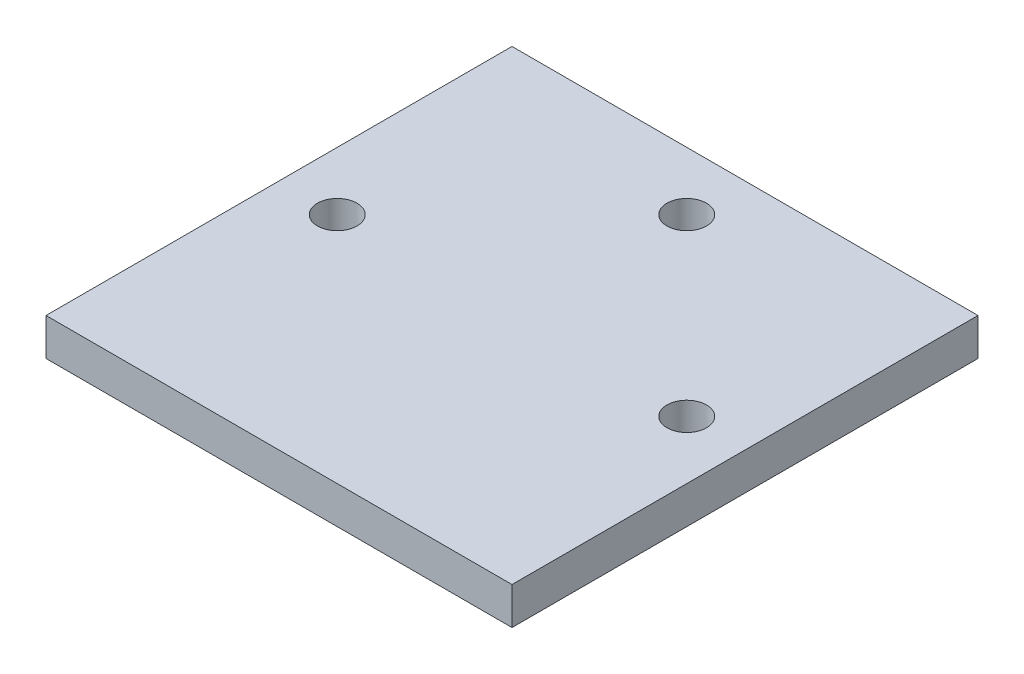
ISO-10303-21;
HEADER;
FILE_DESCRIPTION(('STEP AP214'),'2;1');
FILE_NAME('part.step','',(''),(''),'','','');
FILE_SCHEMA(('AUTOMOTIVE_DESIGN { 1 0 10303 214 1 1 1 1 }'));
ENDSEC;
DATA;
#1=APPLICATION_CONTEXT('core data for automotive mechanical design processes');
#2=APPLICATION_PROTOCOL_DEFINITION('international standard','automotive_design',2000,#1);
#3=PRODUCT_CONTEXT('',#1,'mechanical');
#4=PRODUCT('Part','Part','',(#3));
#5=PRODUCT_RELATED_PRODUCT_CATEGORY('part','',(#4));
#6=PRODUCT_DEFINITION_FORMATION('','',#4);
#7=PRODUCT_DEFINITION_CONTEXT('part definition',#1,'design');
#8=PRODUCT_DEFINITION('design','',#6,#7);
#9=PRODUCT_DEFINITION_SHAPE('','',#8);
#10=(LENGTH_UNIT() NAMED_UNIT(*) SI_UNIT(.MILLI.,.METRE.));
#11=(NAMED_UNIT(*) PLANE_ANGLE_UNIT() SI_UNIT($,.RADIAN.));
#12=(NAMED_UNIT(*) SI_UNIT($,.STERADIAN.) SOLID_ANGLE_UNIT());
#13=UNCERTAINTY_MEASURE_WITH_UNIT(LENGTH_MEASURE(1.E-05),#10,'distance_accuracy_value','');
#14=(GEOMETRIC_REPRESENTATION_CONTEXT(3) GLOBAL_UNCERTAINTY_ASSIGNED_CONTEXT((#13)) GLOBAL_UNIT_ASSIGNED_CONTEXT((#10,
#11,#12)) REPRESENTATION_CONTEXT('',''));
#15=CARTESIAN_POINT('',(0.,0.,0.));
#16=DIRECTION('',(0.,0.,1.));
#17=DIRECTION('',(1.,0.,0.));
#18=AXIS2_PLACEMENT_3D('',#15,#16,#17);
#19=CARTESIAN_POINT('',(100.,-16.,100.));
#20=DIRECTION('',(1.,0.,0.));
#21=DIRECTION('',(0.,0.,-1.));
#22=AXIS2_PLACEMENT_3D('',#19,#20,#21);
#23=PLANE('',#22);
#24=DIRECTION('',(0.,0.,-1.));
#25=VECTOR('',#24,1.);
#26=CARTESIAN_POINT('',(100.,0.,100.));
#27=LINE('',#26,#25);
#28=CARTESIAN_POINT('',(100.,0.,100.));
#29=VERTEX_POINT('',#28);
#30=CARTESIAN_POINT('',(100.,0.,-100.));
#31=VERTEX_POINT('',#30);
#32=EDGE_CURVE('E102',#29,#31,#27,.T.);
#33=ORIENTED_EDGE('',*,*,#32,.F.);
#34=DIRECTION('',(0.,1.,0.));
#35=VECTOR('',#34,1.);
#36=CARTESIAN_POINT('',(100.,-16.,100.));
#37=LINE('',#36,#35);
#38=CARTESIAN_POINT('',(100.,-16.,100.));
#39=VERTEX_POINT('',#38);
#40=EDGE_CURVE('E11',#39,#29,#37,.T.);
#41=ORIENTED_EDGE('',*,*,#40,.F.);
#42=DIRECTION('',(0.,0.,-1.));
#43=VECTOR('',#42,1.);
#44=CARTESIAN_POINT('',(100.,-16.,100.));
#45=LINE('',#44,#43);
#46=CARTESIAN_POINT('',(100.,-16.,-100.));
#47=VERTEX_POINT('',#46);
#48=EDGE_CURVE('E95',#39,#47,#45,.T.);
#49=ORIENTED_EDGE('',*,*,#48,.T.);
#50=DIRECTION('',(0.,1.,0.));
#51=VECTOR('',#50,1.);
#52=CARTESIAN_POINT('',(100.,-16.,-100.));
#53=LINE('',#52,#51);
#54=EDGE_CURVE('E40',#47,#31,#53,.T.);
#55=ORIENTED_EDGE('',*,*,#54,.T.);
#56=EDGE_LOOP('',(#33,#41,#49,#55));
#57=FACE_BOUND('',#56,.T.);
#58=ADVANCED_FACE('F37',(#57),#23,.T.);
#59=CARTESIAN_POINT('',(-100.,-16.,100.));
#60=DIRECTION('',(0.,0.,1.));
#61=DIRECTION('',(1.,0.,0.));
#62=AXIS2_PLACEMENT_3D('',#59,#60,#61);
#63=PLANE('',#62);
#64=DIRECTION('',(1.,0.,0.));
#65=VECTOR('',#64,1.);
#66=CARTESIAN_POINT('',(-100.,0.,100.));
#67=LINE('',#66,#65);
#68=CARTESIAN_POINT('',(-100.,0.,100.));
#69=VERTEX_POINT('',#68);
#70=EDGE_CURVE('E97',#69,#29,#67,.T.);
#71=ORIENTED_EDGE('',*,*,#70,.F.);
#72=DIRECTION('',(0.,1.,0.));
#73=VECTOR('',#72,1.);
#74=CARTESIAN_POINT('',(-100.,-16.,100.));
#75=LINE('',#74,#73);
#76=CARTESIAN_POINT('',(-100.,-16.,100.));
#77=VERTEX_POINT('',#76);
#78=EDGE_CURVE('E46',#77,#69,#75,.T.);
#79=ORIENTED_EDGE('',*,*,#78,.F.);
#80=DIRECTION('',(1.,0.,0.));
#81=VECTOR('',#80,1.);
#82=CARTESIAN_POINT('',(-100.,-16.,100.));
#83=LINE('',#82,#81);
#84=EDGE_CURVE('E92',#77,#39,#83,.T.);
#85=ORIENTED_EDGE('',*,*,#84,.T.);
#86=ORIENTED_EDGE('',*,*,#40,.T.);
#87=EDGE_LOOP('',(#71,#79,#85,#86));
#88=FACE_BOUND('',#87,.T.);
#89=ADVANCED_FACE('F113',(#88),#63,.T.);
#90=CARTESIAN_POINT('',(-100.,-16.,100.));
#91=DIRECTION('',(-1.,0.,0.));
#92=DIRECTION('',(0.,0.,1.));
#93=AXIS2_PLACEMENT_3D('',#90,#91,#92);
#94=PLANE('',#93);
#95=DIRECTION('',(0.,0.,1.));
#96=VECTOR('',#95,1.);
#97=CARTESIAN_POINT('',(-100.,0.,100.));
#98=LINE('',#97,#96);
#99=CARTESIAN_POINT('',(-100.,0.,-100.));
#100=VERTEX_POINT('',#99);
#101=EDGE_CURVE('E87',#100,#69,#98,.T.);
#102=ORIENTED_EDGE('',*,*,#101,.F.);
#103=DIRECTION('',(0.,1.,0.));
#104=VECTOR('',#103,1.);
#105=CARTESIAN_POINT('',(-100.,-16.,-100.));
#106=LINE('',#105,#104);
#107=CARTESIAN_POINT('',(-100.,-16.,-100.));
#108=VERTEX_POINT('',#107);
#109=EDGE_CURVE('E82',#108,#100,#106,.T.);
#110=ORIENTED_EDGE('',*,*,#109,.F.);
#111=DIRECTION('',(0.,0.,1.));
#112=VECTOR('',#111,1.);
#113=CARTESIAN_POINT('',(-100.,-16.,100.));
#114=LINE('',#113,#112);
#115=EDGE_CURVE('E85',#108,#77,#114,.T.);
#116=ORIENTED_EDGE('',*,*,#115,.T.);
#117=ORIENTED_EDGE('',*,*,#78,.T.);
#118=EDGE_LOOP('',(#102,#110,#116,#117));
#119=FACE_BOUND('',#118,.T.);
#120=ADVANCED_FACE('F84',(#119),#94,.T.);
#121=CARTESIAN_POINT('',(-100.,-16.,-100.));
#122=DIRECTION('',(0.,0.,-1.));
#123=DIRECTION('',(-1.,0.,0.));
#124=AXIS2_PLACEMENT_3D('',#121,#122,#123);
#125=PLANE('',#124);
#126=DIRECTION('',(-1.,0.,0.));
#127=VECTOR('',#126,1.);
#128=CARTESIAN_POINT('',(-100.,0.,-100.));
#129=LINE('',#128,#127);
#130=EDGE_CURVE('E105',#31,#100,#129,.T.);
#131=ORIENTED_EDGE('',*,*,#130,.F.);
#132=ORIENTED_EDGE('',*,*,#54,.F.);
#133=DIRECTION('',(-1.,0.,0.));
#134=VECTOR('',#133,1.);
#135=CARTESIAN_POINT('',(-100.,-16.,-100.));
#136=LINE('',#135,#134);
#137=EDGE_CURVE('E91',#47,#108,#136,.T.);
#138=ORIENTED_EDGE('',*,*,#137,.T.);
#139=ORIENTED_EDGE('',*,*,#109,.T.);
#140=EDGE_LOOP('',(#131,#132,#138,#139));
#141=FACE_BOUND('',#140,.T.);
#142=ADVANCED_FACE('F94',(#141),#125,.T.);
#143=CARTESIAN_POINT('',(0.,-16.,0.));
#144=DIRECTION('',(0.,-1.,0.));
#145=DIRECTION('',(0.,0.,-1.));
#146=AXIS2_PLACEMENT_3D('',#143,#144,#145);
#147=PLANE('',#146);
#148=CARTESIAN_POINT('',(75.,-16.,0.));
#149=DIRECTION('',(0.,1.,0.));
#150=DIRECTION('',(0.,0.,1.));
#151=AXIS2_PLACEMENT_3D('',#148,#149,#150);
#152=CIRCLE('',#151,8.50000000000001);
#153=CARTESIAN_POINT('',(75.,-16.,8.50000000000002));
#154=VERTEX_POINT('',#153);
#155=EDGE_CURVE('E150',#154,#154,#152,.T.);
#156=ORIENTED_EDGE('',*,*,#155,.T.);
#157=EDGE_LOOP('',(#156));
#158=FACE_BOUND('',#157,.T.);
#159=CARTESIAN_POINT('',(-75.,-16.,0.));
#160=DIRECTION('',(0.,1.,0.));
#161=DIRECTION('',(0.,0.,1.));
#162=AXIS2_PLACEMENT_3D('',#159,#160,#161);
#163=CIRCLE('',#162,8.5);
#164=CARTESIAN_POINT('',(-75.,-16.,8.49999999999999));
#165=VERTEX_POINT('',#164);
#166=EDGE_CURVE('E158',#165,#165,#163,.T.);
#167=ORIENTED_EDGE('',*,*,#166,.T.);
#168=EDGE_LOOP('',(#167));
#169=FACE_BOUND('',#168,.T.);
#170=CARTESIAN_POINT('',(0.,-16.,-75.));
#171=DIRECTION('',(0.,1.,0.));
#172=DIRECTION('',(0.,0.,1.));
#173=AXIS2_PLACEMENT_3D('',#170,#171,#172);
#174=CIRCLE('',#173,8.5);
#175=CARTESIAN_POINT('',(0.,-16.,-66.5));
#176=VERTEX_POINT('',#175);
#177=EDGE_CURVE('E106',#176,#176,#174,.T.);
#178=ORIENTED_EDGE('',*,*,#177,.T.);
#179=EDGE_LOOP('',(#178));
#180=FACE_BOUND('',#179,.T.);
#181=ORIENTED_EDGE('',*,*,#48,.F.);
#182=ORIENTED_EDGE('',*,*,#84,.F.);
#183=ORIENTED_EDGE('',*,*,#115,.F.);
#184=ORIENTED_EDGE('',*,*,#137,.F.);
#185=EDGE_LOOP('',(#181,#182,#183,#184));
#186=FACE_BOUND('',#185,.T.);
#187=ADVANCED_FACE('F90',(#158,#169,#180,#186),#147,.T.);
#188=CARTESIAN_POINT('',(0.,0.,0.));
#189=DIRECTION('',(0.,-1.,0.));
#190=DIRECTION('',(0.,0.,-1.));
#191=AXIS2_PLACEMENT_3D('',#188,#189,#190);
#192=PLANE('',#191);
#193=CARTESIAN_POINT('',(75.,0.,0.));
#194=DIRECTION('',(0.,1.,0.));
#195=DIRECTION('',(0.,0.,1.));
#196=AXIS2_PLACEMENT_3D('',#193,#194,#195);
#197=CIRCLE('',#196,8.50000000000001);
#198=CARTESIAN_POINT('',(75.,0.,8.50000000000002));
#199=VERTEX_POINT('',#198);
#200=EDGE_CURVE('E153',#199,#199,#197,.T.);
#201=ORIENTED_EDGE('',*,*,#200,.F.);
#202=EDGE_LOOP('',(#201));
#203=FACE_BOUND('',#202,.T.);
#204=CARTESIAN_POINT('',(-75.,0.,0.));
#205=DIRECTION('',(0.,1.,0.));
#206=DIRECTION('',(0.,0.,1.));
#207=AXIS2_PLACEMENT_3D('',#204,#205,#206);
#208=CIRCLE('',#207,8.5);
#209=CARTESIAN_POINT('',(-75.,0.,8.49999999999999));
#210=VERTEX_POINT('',#209);
#211=EDGE_CURVE('E155',#210,#210,#208,.T.);
#212=ORIENTED_EDGE('',*,*,#211,.F.);
#213=EDGE_LOOP('',(#212));
#214=FACE_BOUND('',#213,.T.);
#215=CARTESIAN_POINT('',(0.,0.,-75.));
#216=DIRECTION('',(0.,1.,0.));
#217=DIRECTION('',(0.,0.,1.));
#218=AXIS2_PLACEMENT_3D('',#215,#216,#217);
#219=CIRCLE('',#218,8.5);
#220=CARTESIAN_POINT('',(0.,0.,-66.5));
#221=VERTEX_POINT('',#220);
#222=EDGE_CURVE('E161',#221,#221,#219,.T.);
#223=ORIENTED_EDGE('',*,*,#222,.F.);
#224=EDGE_LOOP('',(#223));
#225=FACE_BOUND('',#224,.T.);
#226=ORIENTED_EDGE('',*,*,#32,.T.);
#227=ORIENTED_EDGE('',*,*,#130,.T.);
#228=ORIENTED_EDGE('',*,*,#101,.T.);
#229=ORIENTED_EDGE('',*,*,#70,.T.);
#230=EDGE_LOOP('',(#226,#227,#228,#229));
#231=FACE_BOUND('',#230,.T.);
#232=ADVANCED_FACE('F112',(#203,#214,#225,#231),#192,.F.);
#233=CARTESIAN_POINT('',(0.,-16.,-75.));
#234=DIRECTION('',(0.,1.,0.));
#235=DIRECTION('',(0.,0.,1.));
#236=AXIS2_PLACEMENT_3D('',#233,#234,#235);
#237=CYLINDRICAL_SURFACE('',#236,8.5);
#238=ORIENTED_EDGE('',*,*,#177,.F.);
#239=EDGE_LOOP('',(#238));
#240=FACE_BOUND('',#239,.T.);
#241=ORIENTED_EDGE('',*,*,#222,.T.);
#242=EDGE_LOOP('',(#241));
#243=FACE_BOUND('',#242,.T.);
#244=ADVANCED_FACE('F131',(#240,#243),#237,.F.);
#245=CARTESIAN_POINT('',(-75.,-16.,0.));
#246=DIRECTION('',(0.,1.,0.));
#247=DIRECTION('',(0.,0.,1.));
#248=AXIS2_PLACEMENT_3D('',#245,#246,#247);
#249=CYLINDRICAL_SURFACE('',#248,8.5);
#250=ORIENTED_EDGE('',*,*,#166,.F.);
#251=EDGE_LOOP('',(#250));
#252=FACE_BOUND('',#251,.T.);
#253=ORIENTED_EDGE('',*,*,#211,.T.);
#254=EDGE_LOOP('',(#253));
#255=FACE_BOUND('',#254,.T.);
#256=ADVANCED_FACE('F138',(#252,#255),#249,.F.);
#257=CARTESIAN_POINT('',(75.,-16.,0.));
#258=DIRECTION('',(0.,1.,0.));
#259=DIRECTION('',(0.,0.,1.));
#260=AXIS2_PLACEMENT_3D('',#257,#258,#259);
#261=CYLINDRICAL_SURFACE('',#260,8.50000000000001);
#262=ORIENTED_EDGE('',*,*,#155,.F.);
#263=EDGE_LOOP('',(#262));
#264=FACE_BOUND('',#263,.T.);
#265=ORIENTED_EDGE('',*,*,#200,.T.);
#266=EDGE_LOOP('',(#265));
#267=FACE_BOUND('',#266,.T.);
#268=ADVANCED_FACE('F142',(#264,#267),#261,.F.);
#269=CLOSED_SHELL('',(#58,#89,#120,#142,#187,#232,#244,#256,#268));
#270=MANIFOLD_SOLID_BREP('B2',#269);
#271=ADVANCED_BREP_SHAPE_REPRESENTATION('',(#18,#270),#14);
#272=SHAPE_DEFINITION_REPRESENTATION(#9,#271);
ENDSEC;
END-ISO-10303-21;
